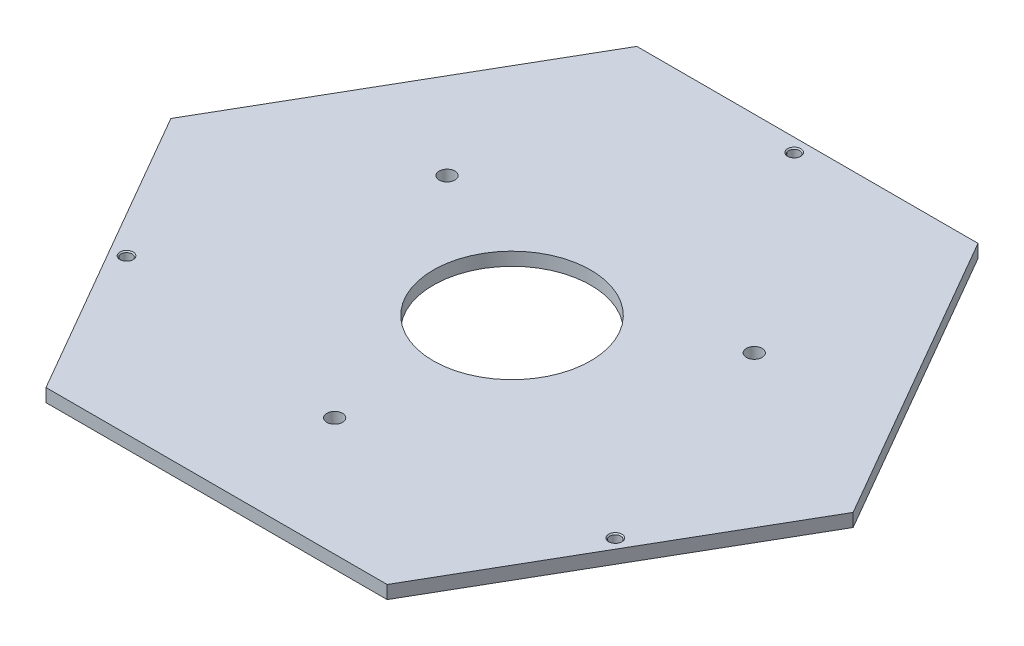
ISO-10303-21;
HEADER;
FILE_DESCRIPTION(('STEP AP214'),'2;1');
FILE_NAME('part.step','',(''),(''),'','','');
FILE_SCHEMA(('AUTOMOTIVE_DESIGN { 1 0 10303 214 1 1 1 1 }'));
ENDSEC;
DATA;
#1=APPLICATION_CONTEXT('core data for automotive mechanical design processes');
#2=APPLICATION_PROTOCOL_DEFINITION('international standard','automotive_design',2000,#1);
#3=PRODUCT_CONTEXT('',#1,'mechanical');
#4=PRODUCT('Part','Part','',(#3));
#5=PRODUCT_RELATED_PRODUCT_CATEGORY('part','',(#4));
#6=PRODUCT_DEFINITION_FORMATION('','',#4);
#7=PRODUCT_DEFINITION_CONTEXT('part definition',#1,'design');
#8=PRODUCT_DEFINITION('design','',#6,#7);
#9=PRODUCT_DEFINITION_SHAPE('','',#8);
#10=(LENGTH_UNIT() NAMED_UNIT(*) SI_UNIT(.MILLI.,.METRE.));
#11=(NAMED_UNIT(*) PLANE_ANGLE_UNIT() SI_UNIT($,.RADIAN.));
#12=(NAMED_UNIT(*) SI_UNIT($,.STERADIAN.) SOLID_ANGLE_UNIT());
#13=UNCERTAINTY_MEASURE_WITH_UNIT(LENGTH_MEASURE(1.E-05),#10,'distance_accuracy_value','');
#14=(GEOMETRIC_REPRESENTATION_CONTEXT(3) GLOBAL_UNCERTAINTY_ASSIGNED_CONTEXT((#13)) GLOBAL_UNIT_ASSIGNED_CONTEXT((#10,
#11,#12)) REPRESENTATION_CONTEXT('',''));
#15=CARTESIAN_POINT('',(0.,0.,0.));
#16=DIRECTION('',(0.,0.,1.));
#17=DIRECTION('',(1.,0.,0.));
#18=AXIS2_PLACEMENT_3D('',#15,#16,#17);
#19=CARTESIAN_POINT('',(65.0000000000012,5.,112.583302491976));
#20=DIRECTION('',(-0.866025403784442,0.,-0.499999999999995));
#21=DIRECTION('',(-0.499999999999995,0.,0.866025403784442));
#22=AXIS2_PLACEMENT_3D('',#19,#20,#21);
#23=PLANE('',#22);
#24=DIRECTION('',(0.499999999999995,0.,-0.866025403784441));
#25=VECTOR('',#24,1.);
#26=CARTESIAN_POINT('',(65.0000000000012,0.,112.583302491976));
#27=LINE('',#26,#25);
#28=CARTESIAN_POINT('',(65.0000000000012,0.,112.583302491976));
#29=VERTEX_POINT('',#28);
#30=CARTESIAN_POINT('',(130.,0.,0.));
#31=VERTEX_POINT('',#30);
#32=EDGE_CURVE('E133',#29,#31,#27,.T.);
#33=ORIENTED_EDGE('',*,*,#32,.T.);
#34=DIRECTION('',(0.,-1.,0.));
#35=VECTOR('',#34,1.);
#36=CARTESIAN_POINT('',(130.,5.,0.));
#37=LINE('',#36,#35);
#38=CARTESIAN_POINT('',(130.,5.,0.));
#39=VERTEX_POINT('',#38);
#40=EDGE_CURVE('E11',#39,#31,#37,.T.);
#41=ORIENTED_EDGE('',*,*,#40,.F.);
#42=DIRECTION('',(0.499999999999995,0.,-0.866025403784441));
#43=VECTOR('',#42,1.);
#44=CARTESIAN_POINT('',(65.0000000000012,5.,112.583302491976));
#45=LINE('',#44,#43);
#46=CARTESIAN_POINT('',(65.0000000000012,5.,112.583302491976));
#47=VERTEX_POINT('',#46);
#48=EDGE_CURVE('E150',#47,#39,#45,.T.);
#49=ORIENTED_EDGE('',*,*,#48,.F.);
#50=DIRECTION('',(0.,-1.,0.));
#51=VECTOR('',#50,1.);
#52=CARTESIAN_POINT('',(65.0000000000012,5.,112.583302491976));
#53=LINE('',#52,#51);
#54=EDGE_CURVE('E129',#47,#29,#53,.T.);
#55=ORIENTED_EDGE('',*,*,#54,.T.);
#56=EDGE_LOOP('',(#33,#41,#49,#55));
#57=FACE_BOUND('',#56,.T.);
#58=ADVANCED_FACE('F44',(#57),#23,.F.);
#59=CARTESIAN_POINT('',(130.,5.,0.));
#60=DIRECTION('',(-0.866025403784438,0.,0.500000000000001));
#61=DIRECTION('',(0.500000000000001,0.,0.866025403784438));
#62=AXIS2_PLACEMENT_3D('',#59,#60,#61);
#63=PLANE('',#62);
#64=DIRECTION('',(-0.500000000000001,0.,-0.866025403784438));
#65=VECTOR('',#64,1.);
#66=CARTESIAN_POINT('',(130.,0.,0.));
#67=LINE('',#66,#65);
#68=CARTESIAN_POINT('',(64.9999999999996,0.,-112.583302491977));
#69=VERTEX_POINT('',#68);
#70=EDGE_CURVE('E137',#31,#69,#67,.T.);
#71=ORIENTED_EDGE('',*,*,#70,.T.);
#72=DIRECTION('',(0.,-1.,0.));
#73=VECTOR('',#72,1.);
#74=CARTESIAN_POINT('',(64.9999999999996,5.,-112.583302491977));
#75=LINE('',#74,#73);
#76=CARTESIAN_POINT('',(64.9999999999996,5.,-112.583302491977));
#77=VERTEX_POINT('',#76);
#78=EDGE_CURVE('E53',#77,#69,#75,.T.);
#79=ORIENTED_EDGE('',*,*,#78,.F.);
#80=DIRECTION('',(-0.500000000000001,0.,-0.866025403784438));
#81=VECTOR('',#80,1.);
#82=CARTESIAN_POINT('',(130.,5.,0.));
#83=LINE('',#82,#81);
#84=EDGE_CURVE('E98',#39,#77,#83,.T.);
#85=ORIENTED_EDGE('',*,*,#84,.F.);
#86=ORIENTED_EDGE('',*,*,#40,.T.);
#87=EDGE_LOOP('',(#71,#79,#85,#86));
#88=FACE_BOUND('',#87,.T.);
#89=ADVANCED_FACE('F180',(#88),#63,.F.);
#90=CARTESIAN_POINT('',(64.9999999999996,5.,-112.583302491977));
#91=DIRECTION('',(0.,0.,1.));
#92=DIRECTION('',(1.,0.,0.));
#93=AXIS2_PLACEMENT_3D('',#90,#91,#92);
#94=PLANE('',#93);
#95=DIRECTION('',(-1.,0.,0.));
#96=VECTOR('',#95,1.);
#97=CARTESIAN_POINT('',(64.9999999999996,0.,-112.583302491977));
#98=LINE('',#97,#96);
#99=CARTESIAN_POINT('',(-65.0000000000004,0.,-112.583302491976));
#100=VERTEX_POINT('',#99);
#101=EDGE_CURVE('E141',#69,#100,#98,.T.);
#102=ORIENTED_EDGE('',*,*,#101,.T.);
#103=DIRECTION('',(0.,-1.,0.));
#104=VECTOR('',#103,1.);
#105=CARTESIAN_POINT('',(-65.0000000000004,5.,-112.583302491976));
#106=LINE('',#105,#104);
#107=CARTESIAN_POINT('',(-65.0000000000004,5.,-112.583302491976));
#108=VERTEX_POINT('',#107);
#109=EDGE_CURVE('E122',#108,#100,#106,.T.);
#110=ORIENTED_EDGE('',*,*,#109,.F.);
#111=DIRECTION('',(-1.,0.,0.));
#112=VECTOR('',#111,1.);
#113=CARTESIAN_POINT('',(64.9999999999996,5.,-112.583302491977));
#114=LINE('',#113,#112);
#115=EDGE_CURVE('E111',#77,#108,#114,.T.);
#116=ORIENTED_EDGE('',*,*,#115,.F.);
#117=ORIENTED_EDGE('',*,*,#78,.T.);
#118=EDGE_LOOP('',(#102,#110,#116,#117));
#119=FACE_BOUND('',#118,.T.);
#120=ADVANCED_FACE('F160',(#119),#94,.F.);
#121=CARTESIAN_POINT('',(-65.0000000000004,5.,-112.583302491976));
#122=DIRECTION('',(0.866025403784442,0.,0.499999999999995));
#123=DIRECTION('',(0.499999999999995,0.,-0.866025403784442));
#124=AXIS2_PLACEMENT_3D('',#121,#122,#123);
#125=PLANE('',#124);
#126=DIRECTION('',(-0.499999999999995,0.,0.866025403784441));
#127=VECTOR('',#126,1.);
#128=CARTESIAN_POINT('',(-65.0000000000004,0.,-112.583302491976));
#129=LINE('',#128,#127);
#130=CARTESIAN_POINT('',(-130.,0.,9.07785148099213E-13));
#131=VERTEX_POINT('',#130);
#132=EDGE_CURVE('E120',#100,#131,#129,.T.);
#133=ORIENTED_EDGE('',*,*,#132,.T.);
#134=DIRECTION('',(0.,-1.,0.));
#135=VECTOR('',#134,1.);
#136=CARTESIAN_POINT('',(-130.,5.,9.07785148099213E-13));
#137=LINE('',#136,#135);
#138=CARTESIAN_POINT('',(-130.,5.,9.07785148099213E-13));
#139=VERTEX_POINT('',#138);
#140=EDGE_CURVE('E117',#139,#131,#137,.T.);
#141=ORIENTED_EDGE('',*,*,#140,.F.);
#142=DIRECTION('',(-0.499999999999995,0.,0.866025403784441));
#143=VECTOR('',#142,1.);
#144=CARTESIAN_POINT('',(-65.0000000000004,5.,-112.583302491976));
#145=LINE('',#144,#143);
#146=EDGE_CURVE('E105',#108,#139,#145,.T.);
#147=ORIENTED_EDGE('',*,*,#146,.F.);
#148=ORIENTED_EDGE('',*,*,#109,.T.);
#149=EDGE_LOOP('',(#133,#141,#147,#148));
#150=FACE_BOUND('',#149,.T.);
#151=ADVANCED_FACE('F118',(#150),#125,.F.);
#152=CARTESIAN_POINT('',(-130.,5.,9.07785148099213E-13));
#153=DIRECTION('',(0.866025403784435,0.,-0.500000000000007));
#154=DIRECTION('',(-0.500000000000007,0.,-0.866025403784435));
#155=AXIS2_PLACEMENT_3D('',#152,#153,#154);
#156=PLANE('',#155);
#157=DIRECTION('',(0.500000000000007,0.,0.866025403784434));
#158=VECTOR('',#157,1.);
#159=CARTESIAN_POINT('',(-130.,0.,9.07785148099213E-13));
#160=LINE('',#159,#158);
#161=CARTESIAN_POINT('',(-64.9999999999988,0.,112.583302491977));
#162=VERTEX_POINT('',#161);
#163=EDGE_CURVE('E84',#131,#162,#160,.T.);
#164=ORIENTED_EDGE('',*,*,#163,.T.);
#165=DIRECTION('',(0.,-1.,0.));
#166=VECTOR('',#165,1.);
#167=CARTESIAN_POINT('',(-64.9999999999988,5.,112.583302491977));
#168=LINE('',#167,#166);
#169=CARTESIAN_POINT('',(-64.9999999999988,5.,112.583302491977));
#170=VERTEX_POINT('',#169);
#171=EDGE_CURVE('E123',#170,#162,#168,.T.);
#172=ORIENTED_EDGE('',*,*,#171,.F.);
#173=DIRECTION('',(0.500000000000007,0.,0.866025403784434));
#174=VECTOR('',#173,1.);
#175=CARTESIAN_POINT('',(-130.,5.,9.07785148099213E-13));
#176=LINE('',#175,#174);
#177=EDGE_CURVE('E109',#139,#170,#176,.T.);
#178=ORIENTED_EDGE('',*,*,#177,.F.);
#179=ORIENTED_EDGE('',*,*,#140,.T.);
#180=EDGE_LOOP('',(#164,#172,#178,#179));
#181=FACE_BOUND('',#180,.T.);
#182=ADVANCED_FACE('F125',(#181),#156,.F.);
#183=CARTESIAN_POINT('',(-64.9999999999988,5.,112.583302491977));
#184=DIRECTION('',(0.,0.,-1.));
#185=DIRECTION('',(-1.,0.,0.));
#186=AXIS2_PLACEMENT_3D('',#183,#184,#185);
#187=PLANE('',#186);
#188=DIRECTION('',(1.,0.,0.));
#189=VECTOR('',#188,1.);
#190=CARTESIAN_POINT('',(-64.9999999999988,0.,112.583302491977));
#191=LINE('',#190,#189);
#192=EDGE_CURVE('E90',#162,#29,#191,.T.);
#193=ORIENTED_EDGE('',*,*,#192,.T.);
#194=ORIENTED_EDGE('',*,*,#54,.F.);
#195=DIRECTION('',(1.,0.,0.));
#196=VECTOR('',#195,1.);
#197=CARTESIAN_POINT('',(-64.9999999999988,5.,112.583302491977));
#198=LINE('',#197,#196);
#199=EDGE_CURVE('E61',#170,#47,#198,.T.);
#200=ORIENTED_EDGE('',*,*,#199,.F.);
#201=ORIENTED_EDGE('',*,*,#171,.T.);
#202=EDGE_LOOP('',(#193,#194,#200,#201));
#203=FACE_BOUND('',#202,.T.);
#204=ADVANCED_FACE('F167',(#203),#187,.F.);
#205=CARTESIAN_POINT('',(0.,5.,0.));
#206=DIRECTION('',(0.,1.,0.));
#207=DIRECTION('',(0.,0.,1.));
#208=AXIS2_PLACEMENT_3D('',#205,#206,#207);
#209=PLANE('',#208);
#210=CARTESIAN_POINT('',(-93.1265717108879,5.,53.7666512459891));
#211=DIRECTION('',(0.,1.,0.));
#212=DIRECTION('',(0.,0.,1.));
#213=AXIS2_PLACEMENT_3D('',#210,#211,#212);
#214=CIRCLE('',#213,2.525);
#215=CARTESIAN_POINT('',(-93.1265717108879,5.,56.2916512459891));
#216=VERTEX_POINT('',#215);
#217=EDGE_CURVE('E379',#216,#216,#214,.T.);
#218=ORIENTED_EDGE('',*,*,#217,.F.);
#219=EDGE_LOOP('',(#218));
#220=FACE_BOUND('',#219,.T.);
#221=CARTESIAN_POINT('',(93.126571710889,5.,53.766651245988));
#222=DIRECTION('',(0.,1.,0.));
#223=DIRECTION('',(0.,0.,1.));
#224=AXIS2_PLACEMENT_3D('',#221,#222,#223);
#225=CIRCLE('',#224,2.525);
#226=CARTESIAN_POINT('',(93.126571710889,5.,56.291651245988));
#227=VERTEX_POINT('',#226);
#228=EDGE_CURVE('E389',#227,#227,#225,.T.);
#229=ORIENTED_EDGE('',*,*,#228,.F.);
#230=EDGE_LOOP('',(#229));
#231=FACE_BOUND('',#230,.T.);
#232=CARTESIAN_POINT('',(0.,5.,-107.533302491977));
#233=DIRECTION('',(0.,1.,0.));
#234=DIRECTION('',(0.,0.,1.));
#235=AXIS2_PLACEMENT_3D('',#232,#233,#234);
#236=CIRCLE('',#235,2.525);
#237=CARTESIAN_POINT('',(0.,5.,-105.008302491977));
#238=VERTEX_POINT('',#237);
#239=EDGE_CURVE('E401',#238,#238,#236,.T.);
#240=ORIENTED_EDGE('',*,*,#239,.F.);
#241=EDGE_LOOP('',(#240));
#242=FACE_BOUND('',#241,.T.);
#243=CARTESIAN_POINT('',(-58.5288568297002,5.,-33.791651245988));
#244=DIRECTION('',(0.,1.,0.));
#245=DIRECTION('',(0.,0.,1.));
#246=AXIS2_PLACEMENT_3D('',#243,#244,#245);
#247=CIRCLE('',#246,3.00000000000002);
#248=CARTESIAN_POINT('',(-58.5288568297002,5.,-30.791651245988));
#249=VERTEX_POINT('',#248);
#250=EDGE_CURVE('E419',#249,#249,#247,.T.);
#251=ORIENTED_EDGE('',*,*,#250,.F.);
#252=EDGE_LOOP('',(#251));
#253=FACE_BOUND('',#252,.T.);
#254=CARTESIAN_POINT('',(58.5288568297,5.,-33.7916512459883));
#255=DIRECTION('',(0.,1.,0.));
#256=DIRECTION('',(0.,0.,1.));
#257=AXIS2_PLACEMENT_3D('',#254,#255,#256);
#258=CIRCLE('',#257,3.00000000000001);
#259=CARTESIAN_POINT('',(58.5288568297,5.,-30.7916512459883));
#260=VERTEX_POINT('',#259);
#261=EDGE_CURVE('E423',#260,#260,#258,.T.);
#262=ORIENTED_EDGE('',*,*,#261,.F.);
#263=EDGE_LOOP('',(#262));
#264=FACE_BOUND('',#263,.T.);
#265=CARTESIAN_POINT('',(0.,5.,67.5833024919774));
#266=DIRECTION('',(0.,1.,0.));
#267=DIRECTION('',(0.,0.,1.));
#268=AXIS2_PLACEMENT_3D('',#265,#266,#267);
#269=CIRCLE('',#268,3.);
#270=CARTESIAN_POINT('',(0.,5.,70.5833024919774));
#271=VERTEX_POINT('',#270);
#272=EDGE_CURVE('E431',#271,#271,#269,.T.);
#273=ORIENTED_EDGE('',*,*,#272,.F.);
#274=EDGE_LOOP('',(#273));
#275=FACE_BOUND('',#274,.T.);
#276=CARTESIAN_POINT('',(0.,5.,0.));
#277=DIRECTION('',(0.,1.,0.));
#278=DIRECTION('',(0.,0.,1.));
#279=AXIS2_PLACEMENT_3D('',#276,#277,#278);
#280=CIRCLE('',#279,30.);
#281=CARTESIAN_POINT('',(0.,5.,30.));
#282=VERTEX_POINT('',#281);
#283=EDGE_CURVE('E418',#282,#282,#280,.T.);
#284=ORIENTED_EDGE('',*,*,#283,.F.);
#285=EDGE_LOOP('',(#284));
#286=FACE_BOUND('',#285,.T.);
#287=ORIENTED_EDGE('',*,*,#48,.T.);
#288=ORIENTED_EDGE('',*,*,#84,.T.);
#289=ORIENTED_EDGE('',*,*,#115,.T.);
#290=ORIENTED_EDGE('',*,*,#146,.T.);
#291=ORIENTED_EDGE('',*,*,#177,.T.);
#292=ORIENTED_EDGE('',*,*,#199,.T.);
#293=EDGE_LOOP('',(#287,#288,#289,#290,#291,#292));
#294=FACE_BOUND('',#293,.T.);
#295=ADVANCED_FACE('F107',(#220,#231,#242,#253,#264,#275,#286,#294),#209,.T.);
#296=CARTESIAN_POINT('',(0.,0.,0.));
#297=DIRECTION('',(0.,1.,0.));
#298=DIRECTION('',(0.,0.,1.));
#299=AXIS2_PLACEMENT_3D('',#296,#297,#298);
#300=PLANE('',#299);
#301=CARTESIAN_POINT('',(-93.1265717108879,0.,53.7666512459891));
#302=DIRECTION('',(0.,1.,0.));
#303=DIRECTION('',(0.,0.,1.));
#304=AXIS2_PLACEMENT_3D('',#301,#302,#303);
#305=CIRCLE('',#304,2.1);
#306=CARTESIAN_POINT('',(-93.1265717108879,0.,55.8666512459891));
#307=VERTEX_POINT('',#306);
#308=EDGE_CURVE('E383',#307,#307,#305,.T.);
#309=ORIENTED_EDGE('',*,*,#308,.T.);
#310=EDGE_LOOP('',(#309));
#311=FACE_BOUND('',#310,.T.);
#312=CARTESIAN_POINT('',(93.126571710889,0.,53.766651245988));
#313=DIRECTION('',(0.,1.,0.));
#314=DIRECTION('',(0.,0.,1.));
#315=AXIS2_PLACEMENT_3D('',#312,#313,#314);
#316=CIRCLE('',#315,2.1);
#317=CARTESIAN_POINT('',(93.126571710889,0.,55.866651245988));
#318=VERTEX_POINT('',#317);
#319=EDGE_CURVE('E397',#318,#318,#316,.T.);
#320=ORIENTED_EDGE('',*,*,#319,.T.);
#321=EDGE_LOOP('',(#320));
#322=FACE_BOUND('',#321,.T.);
#323=CARTESIAN_POINT('',(0.,0.,-107.533302491977));
#324=DIRECTION('',(0.,1.,0.));
#325=DIRECTION('',(0.,0.,1.));
#326=AXIS2_PLACEMENT_3D('',#323,#324,#325);
#327=CIRCLE('',#326,2.1);
#328=CARTESIAN_POINT('',(0.,0.,-105.433302491977));
#329=VERTEX_POINT('',#328);
#330=EDGE_CURVE('E409',#329,#329,#327,.T.);
#331=ORIENTED_EDGE('',*,*,#330,.T.);
#332=EDGE_LOOP('',(#331));
#333=FACE_BOUND('',#332,.T.);
#334=CARTESIAN_POINT('',(-58.5288568297002,0.,-33.791651245988));
#335=DIRECTION('',(0.,1.,0.));
#336=DIRECTION('',(0.,0.,1.));
#337=AXIS2_PLACEMENT_3D('',#334,#335,#336);
#338=CIRCLE('',#337,3.00000000000002);
#339=CARTESIAN_POINT('',(-58.5288568297002,0.,-30.791651245988));
#340=VERTEX_POINT('',#339);
#341=EDGE_CURVE('E414',#340,#340,#338,.T.);
#342=ORIENTED_EDGE('',*,*,#341,.T.);
#343=EDGE_LOOP('',(#342));
#344=FACE_BOUND('',#343,.T.);
#345=CARTESIAN_POINT('',(58.5288568297,0.,-33.7916512459883));
#346=DIRECTION('',(0.,1.,0.));
#347=DIRECTION('',(0.,0.,1.));
#348=AXIS2_PLACEMENT_3D('',#345,#346,#347);
#349=CIRCLE('',#348,3.00000000000001);
#350=CARTESIAN_POINT('',(58.5288568297,0.,-30.7916512459883));
#351=VERTEX_POINT('',#350);
#352=EDGE_CURVE('E427',#351,#351,#349,.T.);
#353=ORIENTED_EDGE('',*,*,#352,.T.);
#354=EDGE_LOOP('',(#353));
#355=FACE_BOUND('',#354,.T.);
#356=CARTESIAN_POINT('',(0.,0.,67.5833024919774));
#357=DIRECTION('',(0.,1.,0.));
#358=DIRECTION('',(0.,0.,1.));
#359=AXIS2_PLACEMENT_3D('',#356,#357,#358);
#360=CIRCLE('',#359,3.);
#361=CARTESIAN_POINT('',(0.,0.,70.5833024919774));
#362=VERTEX_POINT('',#361);
#363=EDGE_CURVE('E413',#362,#362,#360,.T.);
#364=ORIENTED_EDGE('',*,*,#363,.T.);
#365=EDGE_LOOP('',(#364));
#366=FACE_BOUND('',#365,.T.);
#367=CARTESIAN_POINT('',(0.,0.,0.));
#368=DIRECTION('',(0.,1.,0.));
#369=DIRECTION('',(0.,0.,1.));
#370=AXIS2_PLACEMENT_3D('',#367,#368,#369);
#371=CIRCLE('',#370,30.);
#372=CARTESIAN_POINT('',(0.,0.,30.));
#373=VERTEX_POINT('',#372);
#374=EDGE_CURVE('E138',#373,#373,#371,.T.);
#375=ORIENTED_EDGE('',*,*,#374,.T.);
#376=EDGE_LOOP('',(#375));
#377=FACE_BOUND('',#376,.T.);
#378=ORIENTED_EDGE('',*,*,#32,.F.);
#379=ORIENTED_EDGE('',*,*,#192,.F.);
#380=ORIENTED_EDGE('',*,*,#163,.F.);
#381=ORIENTED_EDGE('',*,*,#132,.F.);
#382=ORIENTED_EDGE('',*,*,#101,.F.);
#383=ORIENTED_EDGE('',*,*,#70,.F.);
#384=EDGE_LOOP('',(#378,#379,#380,#381,#382,#383));
#385=FACE_BOUND('',#384,.T.);
#386=ADVANCED_FACE('F163',(#311,#322,#333,#344,#355,#366,#377,#385),#300,.F.);
#387=CARTESIAN_POINT('',(0.,0.,0.));
#388=DIRECTION('',(0.,1.,0.));
#389=DIRECTION('',(0.,0.,1.));
#390=AXIS2_PLACEMENT_3D('',#387,#388,#389);
#391=CYLINDRICAL_SURFACE('',#390,30.);
#392=ORIENTED_EDGE('',*,*,#374,.F.);
#393=EDGE_LOOP('',(#392));
#394=FACE_BOUND('',#393,.T.);
#395=ORIENTED_EDGE('',*,*,#283,.T.);
#396=EDGE_LOOP('',(#395));
#397=FACE_BOUND('',#396,.T.);
#398=ADVANCED_FACE('F210',(#394,#397),#391,.F.);
#399=CARTESIAN_POINT('',(0.,0.,67.5833024919774));
#400=DIRECTION('',(0.,1.,0.));
#401=DIRECTION('',(0.,0.,1.));
#402=AXIS2_PLACEMENT_3D('',#399,#400,#401);
#403=CYLINDRICAL_SURFACE('',#402,3.);
#404=ORIENTED_EDGE('',*,*,#363,.F.);
#405=EDGE_LOOP('',(#404));
#406=FACE_BOUND('',#405,.T.);
#407=ORIENTED_EDGE('',*,*,#272,.T.);
#408=EDGE_LOOP('',(#407));
#409=FACE_BOUND('',#408,.T.);
#410=ADVANCED_FACE('F215',(#406,#409),#403,.F.);
#411=CARTESIAN_POINT('',(58.5288568297,0.,-33.7916512459883));
#412=DIRECTION('',(0.,1.,0.));
#413=DIRECTION('',(0.,0.,1.));
#414=AXIS2_PLACEMENT_3D('',#411,#412,#413);
#415=CYLINDRICAL_SURFACE('',#414,3.00000000000001);
#416=ORIENTED_EDGE('',*,*,#352,.F.);
#417=EDGE_LOOP('',(#416));
#418=FACE_BOUND('',#417,.T.);
#419=ORIENTED_EDGE('',*,*,#261,.T.);
#420=EDGE_LOOP('',(#419));
#421=FACE_BOUND('',#420,.T.);
#422=ADVANCED_FACE('F228',(#418,#421),#415,.F.);
#423=CARTESIAN_POINT('',(-58.5288568297002,0.,-33.791651245988));
#424=DIRECTION('',(0.,1.,0.));
#425=DIRECTION('',(0.,0.,1.));
#426=AXIS2_PLACEMENT_3D('',#423,#424,#425);
#427=CYLINDRICAL_SURFACE('',#426,3.00000000000002);
#428=ORIENTED_EDGE('',*,*,#341,.F.);
#429=EDGE_LOOP('',(#428));
#430=FACE_BOUND('',#429,.T.);
#431=ORIENTED_EDGE('',*,*,#250,.T.);
#432=EDGE_LOOP('',(#431));
#433=FACE_BOUND('',#432,.T.);
#434=ADVANCED_FACE('F239',(#430,#433),#427,.F.);
#435=CARTESIAN_POINT('',(0.,5.,-107.533302491977));
#436=DIRECTION('',(0.,1.,0.));
#437=DIRECTION('',(0.,0.,1.));
#438=AXIS2_PLACEMENT_3D('',#435,#436,#437);
#439=CYLINDRICAL_SURFACE('',#438,2.09999999999999);
#440=ORIENTED_EDGE('',*,*,#330,.F.);
#441=EDGE_LOOP('',(#440));
#442=FACE_BOUND('',#441,.T.);
#443=CARTESIAN_POINT('',(0.,4.57499999999999,-107.533302491977));
#444=DIRECTION('',(0.,1.,0.));
#445=DIRECTION('',(0.,0.,1.));
#446=AXIS2_PLACEMENT_3D('',#443,#444,#445);
#447=CIRCLE('',#446,2.09999999999999);
#448=CARTESIAN_POINT('',(0.,4.57499999999999,-105.433302491977));
#449=VERTEX_POINT('',#448);
#450=EDGE_CURVE('E405',#449,#449,#447,.T.);
#451=ORIENTED_EDGE('',*,*,#450,.T.);
#452=EDGE_LOOP('',(#451));
#453=FACE_BOUND('',#452,.T.);
#454=ADVANCED_FACE('F249',(#442,#453),#439,.F.);
#455=CARTESIAN_POINT('',(0.,5.,-107.533302491977));
#456=DIRECTION('',(0.,1.,0.));
#457=DIRECTION('',(0.,0.,1.));
#458=AXIS2_PLACEMENT_3D('',#455,#456,#457);
#459=CONICAL_SURFACE('',#458,2.525,0.78539816339745);
#460=ORIENTED_EDGE('',*,*,#450,.F.);
#461=EDGE_LOOP('',(#460));
#462=FACE_BOUND('',#461,.T.);
#463=ORIENTED_EDGE('',*,*,#239,.T.);
#464=EDGE_LOOP('',(#463));
#465=FACE_BOUND('',#464,.T.);
#466=ADVANCED_FACE('F268',(#462,#465),#459,.F.);
#467=CARTESIAN_POINT('',(93.126571710889,5.,53.766651245988));
#468=DIRECTION('',(0.,1.,0.));
#469=DIRECTION('',(0.,0.,1.));
#470=AXIS2_PLACEMENT_3D('',#467,#468,#469);
#471=CYLINDRICAL_SURFACE('',#470,2.1);
#472=ORIENTED_EDGE('',*,*,#319,.F.);
#473=EDGE_LOOP('',(#472));
#474=FACE_BOUND('',#473,.T.);
#475=CARTESIAN_POINT('',(93.126571710889,4.57499999999999,53.766651245988));
#476=DIRECTION('',(0.,1.,0.));
#477=DIRECTION('',(0.,0.,1.));
#478=AXIS2_PLACEMENT_3D('',#475,#476,#477);
#479=CIRCLE('',#478,2.09999999999999);
#480=CARTESIAN_POINT('',(93.126571710889,4.57499999999999,55.866651245988));
#481=VERTEX_POINT('',#480);
#482=EDGE_CURVE('E393',#481,#481,#479,.T.);
#483=ORIENTED_EDGE('',*,*,#482,.T.);
#484=EDGE_LOOP('',(#483));
#485=FACE_BOUND('',#484,.T.);
#486=ADVANCED_FACE('F280',(#474,#485),#471,.F.);
#487=CARTESIAN_POINT('',(93.126571710889,5.,53.766651245988));
#488=DIRECTION('',(0.,1.,0.));
#489=DIRECTION('',(0.,0.,1.));
#490=AXIS2_PLACEMENT_3D('',#487,#488,#489);
#491=CONICAL_SURFACE('',#490,2.525,0.785398163397446);
#492=ORIENTED_EDGE('',*,*,#482,.F.);
#493=EDGE_LOOP('',(#492));
#494=FACE_BOUND('',#493,.T.);
#495=ORIENTED_EDGE('',*,*,#228,.T.);
#496=EDGE_LOOP('',(#495));
#497=FACE_BOUND('',#496,.T.);
#498=ADVANCED_FACE('F291',(#494,#497),#491,.F.);
#499=CARTESIAN_POINT('',(-93.1265717108879,5.,53.7666512459891));
#500=DIRECTION('',(0.,1.,0.));
#501=DIRECTION('',(0.,0.,1.));
#502=AXIS2_PLACEMENT_3D('',#499,#500,#501);
#503=CYLINDRICAL_SURFACE('',#502,2.1);
#504=ORIENTED_EDGE('',*,*,#308,.F.);
#505=EDGE_LOOP('',(#504));
#506=FACE_BOUND('',#505,.T.);
#507=CARTESIAN_POINT('',(-93.1265717108879,4.57499999999999,53.7666512459891));
#508=DIRECTION('',(0.,1.,0.));
#509=DIRECTION('',(0.,0.,1.));
#510=AXIS2_PLACEMENT_3D('',#507,#508,#509);
#511=CIRCLE('',#510,2.09999999999999);
#512=CARTESIAN_POINT('',(-93.1265717108879,4.57499999999999,55.8666512459891));
#513=VERTEX_POINT('',#512);
#514=EDGE_CURVE('E376',#513,#513,#511,.T.);
#515=ORIENTED_EDGE('',*,*,#514,.T.);
#516=EDGE_LOOP('',(#515));
#517=FACE_BOUND('',#516,.T.);
#518=ADVANCED_FACE('F303',(#506,#517),#503,.F.);
#519=CARTESIAN_POINT('',(-93.1265717108879,5.,53.7666512459891));
#520=DIRECTION('',(0.,1.,0.));
#521=DIRECTION('',(0.,0.,1.));
#522=AXIS2_PLACEMENT_3D('',#519,#520,#521);
#523=CONICAL_SURFACE('',#522,2.525,0.785398163397446);
#524=ORIENTED_EDGE('',*,*,#514,.F.);
#525=EDGE_LOOP('',(#524));
#526=FACE_BOUND('',#525,.T.);
#527=ORIENTED_EDGE('',*,*,#217,.T.);
#528=EDGE_LOOP('',(#527));
#529=FACE_BOUND('',#528,.T.);
#530=ADVANCED_FACE('F314',(#526,#529),#523,.F.);
#531=CLOSED_SHELL('',(#58,#89,#120,#151,#182,#204,#295,#386,#398,#410,#422,#434,#454,#466,#486,
#498,#518,#530));
#532=MANIFOLD_SOLID_BREP('B2',#531);
#533=ADVANCED_BREP_SHAPE_REPRESENTATION('',(#18,#532),#14);
#534=SHAPE_DEFINITION_REPRESENTATION(#9,#533);
ENDSEC;
END-ISO-10303-21;
